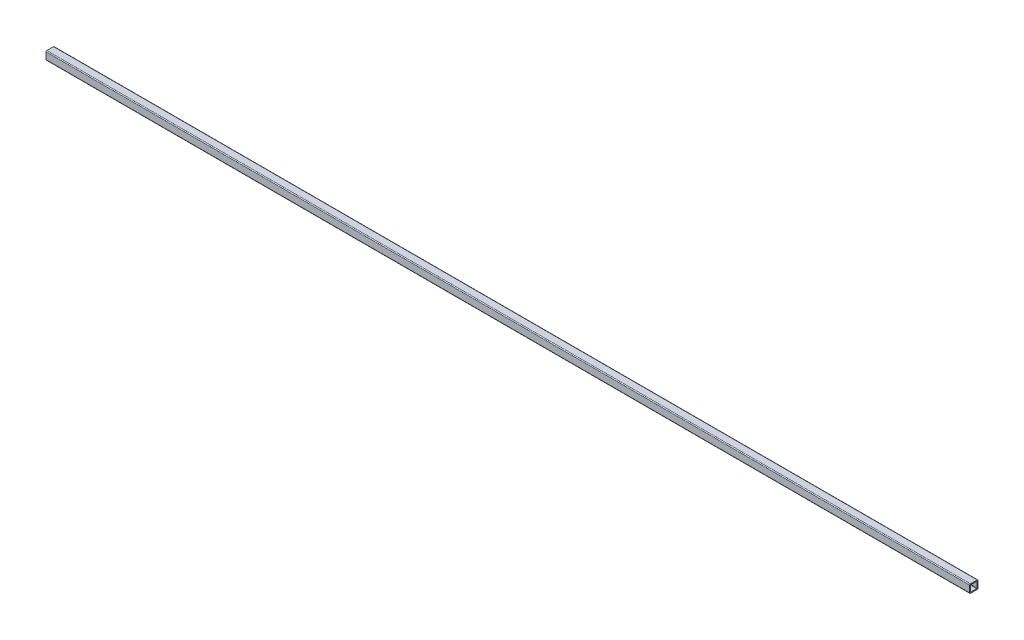
ISO-10303-21;
HEADER;
FILE_DESCRIPTION(('STEP AP214'),'2;1');
FILE_NAME('part.step','',(''),(''),'','','');
FILE_SCHEMA(('AUTOMOTIVE_DESIGN { 1 0 10303 214 1 1 1 1 }'));
ENDSEC;
DATA;
#1=APPLICATION_CONTEXT('core data for automotive mechanical design processes');
#2=APPLICATION_PROTOCOL_DEFINITION('international standard','automotive_design',2000,#1);
#3=PRODUCT_CONTEXT('',#1,'mechanical');
#4=PRODUCT('Part','Part','',(#3));
#5=PRODUCT_RELATED_PRODUCT_CATEGORY('part','',(#4));
#6=PRODUCT_DEFINITION_FORMATION('','',#4);
#7=PRODUCT_DEFINITION_CONTEXT('part definition',#1,'design');
#8=PRODUCT_DEFINITION('design','',#6,#7);
#9=PRODUCT_DEFINITION_SHAPE('','',#8);
#10=(LENGTH_UNIT() NAMED_UNIT(*) SI_UNIT(.MILLI.,.METRE.));
#11=(NAMED_UNIT(*) PLANE_ANGLE_UNIT() SI_UNIT($,.RADIAN.));
#12=(NAMED_UNIT(*) SI_UNIT($,.STERADIAN.) SOLID_ANGLE_UNIT());
#13=UNCERTAINTY_MEASURE_WITH_UNIT(LENGTH_MEASURE(1.E-05),#10,'distance_accuracy_value','');
#14=(GEOMETRIC_REPRESENTATION_CONTEXT(3) GLOBAL_UNCERTAINTY_ASSIGNED_CONTEXT((#13)) GLOBAL_UNIT_ASSIGNED_CONTEXT((#10,
#11,#12)) REPRESENTATION_CONTEXT('',''));
#15=CARTESIAN_POINT('',(0.,0.,0.));
#16=DIRECTION('',(0.,0.,1.));
#17=DIRECTION('',(1.,0.,0.));
#18=AXIS2_PLACEMENT_3D('',#15,#16,#17);
#19=CARTESIAN_POINT('',(-2830.,12.7,-12.7));
#20=DIRECTION('',(0.,0.,-1.));
#21=DIRECTION('',(0.,1.,0.));
#22=AXIS2_PLACEMENT_3D('',#19,#20,#21);
#23=PLANE('',#22);
#24=DIRECTION('',(0.,1.,0.));
#25=VECTOR('',#24,1.);
#26=CARTESIAN_POINT('',(0.,12.7,-12.7));
#27=LINE('',#26,#25);
#28=CARTESIAN_POINT('',(0.,-10.2,-12.7));
#29=VERTEX_POINT('',#28);
#30=CARTESIAN_POINT('',(0.,10.2,-12.7));
#31=VERTEX_POINT('',#30);
#32=EDGE_CURVE('E276',#29,#31,#27,.T.);
#33=ORIENTED_EDGE('',*,*,#32,.F.);
#34=DIRECTION('',(1.,0.,0.));
#35=VECTOR('',#34,1.);
#36=CARTESIAN_POINT('',(-2830.,-10.2,-12.7));
#37=LINE('',#36,#35);
#38=CARTESIAN_POINT('',(-2830.,-10.2,-12.7));
#39=VERTEX_POINT('',#38);
#40=EDGE_CURVE('E194',#29,#39,#37,.F.);
#41=ORIENTED_EDGE('',*,*,#40,.T.);
#42=DIRECTION('',(0.,1.,0.));
#43=VECTOR('',#42,1.);
#44=CARTESIAN_POINT('',(-2830.,12.7,-12.7));
#45=LINE('',#44,#43);
#46=CARTESIAN_POINT('',(-2830.,10.2,-12.7));
#47=VERTEX_POINT('',#46);
#48=EDGE_CURVE('E170',#39,#47,#45,.T.);
#49=ORIENTED_EDGE('',*,*,#48,.T.);
#50=DIRECTION('',(1.,0.,0.));
#51=VECTOR('',#50,1.);
#52=CARTESIAN_POINT('',(-2830.,10.2,-12.7));
#53=LINE('',#52,#51);
#54=EDGE_CURVE('E190',#47,#31,#53,.T.);
#55=ORIENTED_EDGE('',*,*,#54,.T.);
#56=EDGE_LOOP('',(#33,#41,#49,#55));
#57=FACE_BOUND('',#56,.T.);
#58=ADVANCED_FACE('F35',(#57),#23,.T.);
#59=CARTESIAN_POINT('',(-2830.,-12.7,12.7));
#60=DIRECTION('',(0.,-1.,0.));
#61=DIRECTION('',(0.,0.,-1.));
#62=AXIS2_PLACEMENT_3D('',#59,#60,#61);
#63=PLANE('',#62);
#64=DIRECTION('',(0.,0.,-1.));
#65=VECTOR('',#64,1.);
#66=CARTESIAN_POINT('',(-2830.,-12.7,12.7));
#67=LINE('',#66,#65);
#68=CARTESIAN_POINT('',(-2830.,-12.7,10.2));
#69=VERTEX_POINT('',#68);
#70=CARTESIAN_POINT('',(-2830.,-12.7,-10.2));
#71=VERTEX_POINT('',#70);
#72=EDGE_CURVE('E176',#69,#71,#67,.T.);
#73=ORIENTED_EDGE('',*,*,#72,.T.);
#74=DIRECTION('',(1.,0.,0.));
#75=VECTOR('',#74,1.);
#76=CARTESIAN_POINT('',(-2830.,-12.7,-10.2));
#77=LINE('',#76,#75);
#78=CARTESIAN_POINT('',(0.,-12.7,-10.2));
#79=VERTEX_POINT('',#78);
#80=EDGE_CURVE('E169',#71,#79,#77,.T.);
#81=ORIENTED_EDGE('',*,*,#80,.T.);
#82=DIRECTION('',(0.,0.,-1.));
#83=VECTOR('',#82,1.);
#84=CARTESIAN_POINT('',(0.,-12.7,12.7));
#85=LINE('',#84,#83);
#86=CARTESIAN_POINT('',(0.,-12.7,10.2));
#87=VERTEX_POINT('',#86);
#88=EDGE_CURVE('E152',#87,#79,#85,.T.);
#89=ORIENTED_EDGE('',*,*,#88,.F.);
#90=DIRECTION('',(1.,0.,0.));
#91=VECTOR('',#90,1.);
#92=CARTESIAN_POINT('',(-2830.,-12.7,10.2));
#93=LINE('',#92,#91);
#94=EDGE_CURVE('E166',#87,#69,#93,.F.);
#95=ORIENTED_EDGE('',*,*,#94,.T.);
#96=EDGE_LOOP('',(#73,#81,#89,#95));
#97=FACE_BOUND('',#96,.T.);
#98=ADVANCED_FACE('F165',(#97),#63,.T.);
#99=CARTESIAN_POINT('',(-2830.,12.7,12.7));
#100=DIRECTION('',(0.,0.,1.));
#101=DIRECTION('',(0.,-1.,0.));
#102=AXIS2_PLACEMENT_3D('',#99,#100,#101);
#103=PLANE('',#102);
#104=DIRECTION('',(0.,-1.,0.));
#105=VECTOR('',#104,1.);
#106=CARTESIAN_POINT('',(-2830.,12.7,12.7));
#107=LINE('',#106,#105);
#108=CARTESIAN_POINT('',(-2830.,10.2,12.7));
#109=VERTEX_POINT('',#108);
#110=CARTESIAN_POINT('',(-2830.,-10.2,12.7));
#111=VERTEX_POINT('',#110);
#112=EDGE_CURVE('E183',#109,#111,#107,.T.);
#113=ORIENTED_EDGE('',*,*,#112,.T.);
#114=DIRECTION('',(1.,0.,0.));
#115=VECTOR('',#114,1.);
#116=CARTESIAN_POINT('',(-2830.,-10.2,12.7));
#117=LINE('',#116,#115);
#118=CARTESIAN_POINT('',(0.,-10.2,12.7));
#119=VERTEX_POINT('',#118);
#120=EDGE_CURVE('E207',#111,#119,#117,.T.);
#121=ORIENTED_EDGE('',*,*,#120,.T.);
#122=DIRECTION('',(0.,-1.,0.));
#123=VECTOR('',#122,1.);
#124=CARTESIAN_POINT('',(0.,12.7,12.7));
#125=LINE('',#124,#123);
#126=CARTESIAN_POINT('',(0.,10.2,12.7));
#127=VERTEX_POINT('',#126);
#128=EDGE_CURVE('E154',#127,#119,#125,.T.);
#129=ORIENTED_EDGE('',*,*,#128,.F.);
#130=DIRECTION('',(1.,0.,0.));
#131=VECTOR('',#130,1.);
#132=CARTESIAN_POINT('',(-2830.,10.2,12.7));
#133=LINE('',#132,#131);
#134=EDGE_CURVE('E204',#127,#109,#133,.F.);
#135=ORIENTED_EDGE('',*,*,#134,.T.);
#136=EDGE_LOOP('',(#113,#121,#129,#135));
#137=FACE_BOUND('',#136,.T.);
#138=ADVANCED_FACE('F320',(#137),#103,.T.);
#139=CARTESIAN_POINT('',(-2830.,12.7,12.7));
#140=DIRECTION('',(0.,1.,0.));
#141=DIRECTION('',(0.,0.,1.));
#142=AXIS2_PLACEMENT_3D('',#139,#140,#141);
#143=PLANE('',#142);
#144=DIRECTION('',(0.,0.,1.));
#145=VECTOR('',#144,1.);
#146=CARTESIAN_POINT('',(0.,12.7,12.7));
#147=LINE('',#146,#145);
#148=CARTESIAN_POINT('',(0.,12.7,-10.2));
#149=VERTEX_POINT('',#148);
#150=CARTESIAN_POINT('',(0.,12.7,10.2));
#151=VERTEX_POINT('',#150);
#152=EDGE_CURVE('E279',#149,#151,#147,.T.);
#153=ORIENTED_EDGE('',*,*,#152,.F.);
#154=DIRECTION('',(1.,0.,0.));
#155=VECTOR('',#154,1.);
#156=CARTESIAN_POINT('',(-2830.,12.7,-10.2));
#157=LINE('',#156,#155);
#158=CARTESIAN_POINT('',(-2830.,12.7,-10.2));
#159=VERTEX_POINT('',#158);
#160=EDGE_CURVE('E214',#149,#159,#157,.F.);
#161=ORIENTED_EDGE('',*,*,#160,.T.);
#162=DIRECTION('',(0.,0.,1.));
#163=VECTOR('',#162,1.);
#164=CARTESIAN_POINT('',(-2830.,12.7,12.7));
#165=LINE('',#164,#163);
#166=CARTESIAN_POINT('',(-2830.,12.7,10.2));
#167=VERTEX_POINT('',#166);
#168=EDGE_CURVE('E294',#159,#167,#165,.T.);
#169=ORIENTED_EDGE('',*,*,#168,.T.);
#170=DIRECTION('',(1.,0.,0.));
#171=VECTOR('',#170,1.);
#172=CARTESIAN_POINT('',(-2830.,12.7,10.2));
#173=LINE('',#172,#171);
#174=EDGE_CURVE('E210',#167,#151,#173,.T.);
#175=ORIENTED_EDGE('',*,*,#174,.T.);
#176=EDGE_LOOP('',(#153,#161,#169,#175));
#177=FACE_BOUND('',#176,.T.);
#178=ADVANCED_FACE('F303',(#177),#143,.T.);
#179=CARTESIAN_POINT('',(-2830.,0.,0.));
#180=DIRECTION('',(1.,0.,0.));
#181=DIRECTION('',(0.,0.,-1.));
#182=AXIS2_PLACEMENT_3D('',#179,#180,#181);
#183=PLANE('',#182);
#184=DIRECTION('',(0.,-1.,0.));
#185=VECTOR('',#184,1.);
#186=CARTESIAN_POINT('',(-2830.,-9.652,9.652));
#187=LINE('',#186,#185);
#188=CARTESIAN_POINT('',(-2830.,8.652,9.652));
#189=VERTEX_POINT('',#188);
#190=CARTESIAN_POINT('',(-2830.,-8.652,9.652));
#191=VERTEX_POINT('',#190);
#192=EDGE_CURVE('E272',#189,#191,#187,.T.);
#193=ORIENTED_EDGE('',*,*,#192,.T.);
#194=CARTESIAN_POINT('',(-2830.,-8.652,8.652));
#195=DIRECTION('',(1.,0.,0.));
#196=DIRECTION('',(0.,0.,-1.));
#197=AXIS2_PLACEMENT_3D('',#194,#195,#196);
#198=CIRCLE('',#197,1.);
#199=CARTESIAN_POINT('',(-2830.,-9.652,8.652));
#200=VERTEX_POINT('',#199);
#201=EDGE_CURVE('E11',#191,#200,#198,.T.);
#202=ORIENTED_EDGE('',*,*,#201,.T.);
#203=DIRECTION('',(0.,0.,-1.));
#204=VECTOR('',#203,1.);
#205=CARTESIAN_POINT('',(-2830.,-9.652,9.652));
#206=LINE('',#205,#204);
#207=CARTESIAN_POINT('',(-2830.,-9.652,-8.652));
#208=VERTEX_POINT('',#207);
#209=EDGE_CURVE('E270',#200,#208,#206,.T.);
#210=ORIENTED_EDGE('',*,*,#209,.T.);
#211=CARTESIAN_POINT('',(-2830.,-8.652,-8.652));
#212=DIRECTION('',(1.,0.,0.));
#213=DIRECTION('',(0.,0.,-1.));
#214=AXIS2_PLACEMENT_3D('',#211,#212,#213);
#215=CIRCLE('',#214,1.);
#216=CARTESIAN_POINT('',(-2830.,-8.652,-9.652));
#217=VERTEX_POINT('',#216);
#218=EDGE_CURVE('E244',#208,#217,#215,.T.);
#219=ORIENTED_EDGE('',*,*,#218,.T.);
#220=DIRECTION('',(0.,1.,0.));
#221=VECTOR('',#220,1.);
#222=CARTESIAN_POINT('',(-2830.,-9.652,-9.652));
#223=LINE('',#222,#221);
#224=CARTESIAN_POINT('',(-2830.,8.652,-9.652));
#225=VERTEX_POINT('',#224);
#226=EDGE_CURVE('E291',#217,#225,#223,.T.);
#227=ORIENTED_EDGE('',*,*,#226,.T.);
#228=CARTESIAN_POINT('',(-2830.,8.652,-8.652));
#229=DIRECTION('',(1.,0.,0.));
#230=DIRECTION('',(0.,0.,-1.));
#231=AXIS2_PLACEMENT_3D('',#228,#229,#230);
#232=CIRCLE('',#231,1.);
#233=CARTESIAN_POINT('',(-2830.,9.652,-8.652));
#234=VERTEX_POINT('',#233);
#235=EDGE_CURVE('E248',#225,#234,#232,.T.);
#236=ORIENTED_EDGE('',*,*,#235,.T.);
#237=DIRECTION('',(0.,0.,1.));
#238=VECTOR('',#237,1.);
#239=CARTESIAN_POINT('',(-2830.,9.652,9.652));
#240=LINE('',#239,#238);
#241=CARTESIAN_POINT('',(-2830.,9.652,8.652));
#242=VERTEX_POINT('',#241);
#243=EDGE_CURVE('E281',#234,#242,#240,.T.);
#244=ORIENTED_EDGE('',*,*,#243,.T.);
#245=CARTESIAN_POINT('',(-2830.,8.652,8.652));
#246=DIRECTION('',(1.,0.,0.));
#247=DIRECTION('',(0.,0.,-1.));
#248=AXIS2_PLACEMENT_3D('',#245,#246,#247);
#249=CIRCLE('',#248,1.);
#250=EDGE_CURVE('E57',#242,#189,#249,.T.);
#251=ORIENTED_EDGE('',*,*,#250,.T.);
#252=EDGE_LOOP('',(#193,#202,#210,#219,#227,#236,#244,#251));
#253=FACE_BOUND('',#252,.T.);
#254=ORIENTED_EDGE('',*,*,#48,.F.);
#255=CARTESIAN_POINT('',(-2830.,-10.2,-10.2));
#256=DIRECTION('',(1.,0.,0.));
#257=DIRECTION('',(0.,0.,-1.));
#258=AXIS2_PLACEMENT_3D('',#255,#256,#257);
#259=CIRCLE('',#258,2.5);
#260=EDGE_CURVE('E202',#39,#71,#259,.F.);
#261=ORIENTED_EDGE('',*,*,#260,.T.);
#262=ORIENTED_EDGE('',*,*,#72,.F.);
#263=CARTESIAN_POINT('',(-2830.,-10.2,10.2));
#264=DIRECTION('',(1.,0.,0.));
#265=DIRECTION('',(0.,0.,-1.));
#266=AXIS2_PLACEMENT_3D('',#263,#264,#265);
#267=CIRCLE('',#266,2.5);
#268=EDGE_CURVE('E174',#69,#111,#267,.F.);
#269=ORIENTED_EDGE('',*,*,#268,.T.);
#270=ORIENTED_EDGE('',*,*,#112,.F.);
#271=CARTESIAN_POINT('',(-2830.,10.2,10.2));
#272=DIRECTION('',(1.,0.,0.));
#273=DIRECTION('',(0.,0.,-1.));
#274=AXIS2_PLACEMENT_3D('',#271,#272,#273);
#275=CIRCLE('',#274,2.5);
#276=EDGE_CURVE('E197',#109,#167,#275,.F.);
#277=ORIENTED_EDGE('',*,*,#276,.T.);
#278=ORIENTED_EDGE('',*,*,#168,.F.);
#279=CARTESIAN_POINT('',(-2830.,10.2,-10.2));
#280=DIRECTION('',(1.,0.,0.));
#281=DIRECTION('',(0.,0.,-1.));
#282=AXIS2_PLACEMENT_3D('',#279,#280,#281);
#283=CIRCLE('',#282,2.5);
#284=EDGE_CURVE('E199',#159,#47,#283,.F.);
#285=ORIENTED_EDGE('',*,*,#284,.T.);
#286=EDGE_LOOP('',(#254,#261,#262,#269,#270,#277,#278,#285));
#287=FACE_BOUND('',#286,.T.);
#288=ADVANCED_FACE('F268',(#253,#287),#183,.F.);
#289=CARTESIAN_POINT('',(0.,0.,0.));
#290=DIRECTION('',(1.,0.,0.));
#291=DIRECTION('',(0.,0.,-1.));
#292=AXIS2_PLACEMENT_3D('',#289,#290,#291);
#293=PLANE('',#292);
#294=DIRECTION('',(0.,1.,0.));
#295=VECTOR('',#294,1.);
#296=CARTESIAN_POINT('',(0.,-9.652,-9.652));
#297=LINE('',#296,#295);
#298=CARTESIAN_POINT('',(0.,-8.652,-9.652));
#299=VERTEX_POINT('',#298);
#300=CARTESIAN_POINT('',(0.,8.652,-9.652));
#301=VERTEX_POINT('',#300);
#302=EDGE_CURVE('E285',#299,#301,#297,.T.);
#303=ORIENTED_EDGE('',*,*,#302,.F.);
#304=CARTESIAN_POINT('',(0.,-8.652,-8.652));
#305=DIRECTION('',(1.,0.,0.));
#306=DIRECTION('',(0.,0.,-1.));
#307=AXIS2_PLACEMENT_3D('',#304,#305,#306);
#308=CIRCLE('',#307,1.);
#309=CARTESIAN_POINT('',(0.,-9.652,-8.652));
#310=VERTEX_POINT('',#309);
#311=EDGE_CURVE('E242',#299,#310,#308,.F.);
#312=ORIENTED_EDGE('',*,*,#311,.T.);
#313=DIRECTION('',(0.,0.,-1.));
#314=VECTOR('',#313,1.);
#315=CARTESIAN_POINT('',(0.,-9.652,9.652));
#316=LINE('',#315,#314);
#317=CARTESIAN_POINT('',(0.,-9.652,8.652));
#318=VERTEX_POINT('',#317);
#319=EDGE_CURVE('E258',#318,#310,#316,.T.);
#320=ORIENTED_EDGE('',*,*,#319,.F.);
#321=CARTESIAN_POINT('',(0.,-8.652,8.652));
#322=DIRECTION('',(1.,0.,0.));
#323=DIRECTION('',(0.,0.,-1.));
#324=AXIS2_PLACEMENT_3D('',#321,#322,#323);
#325=CIRCLE('',#324,1.);
#326=CARTESIAN_POINT('',(0.,-8.652,9.652));
#327=VERTEX_POINT('',#326);
#328=EDGE_CURVE('E43',#318,#327,#325,.F.);
#329=ORIENTED_EDGE('',*,*,#328,.T.);
#330=DIRECTION('',(0.,-1.,0.));
#331=VECTOR('',#330,1.);
#332=CARTESIAN_POINT('',(0.,-9.652,9.652));
#333=LINE('',#332,#331);
#334=CARTESIAN_POINT('',(0.,8.652,9.652));
#335=VERTEX_POINT('',#334);
#336=EDGE_CURVE('E256',#335,#327,#333,.T.);
#337=ORIENTED_EDGE('',*,*,#336,.F.);
#338=CARTESIAN_POINT('',(0.,8.652,8.652));
#339=DIRECTION('',(1.,0.,0.));
#340=DIRECTION('',(0.,0.,-1.));
#341=AXIS2_PLACEMENT_3D('',#338,#339,#340);
#342=CIRCLE('',#341,1.);
#343=CARTESIAN_POINT('',(0.,9.652,8.652));
#344=VERTEX_POINT('',#343);
#345=EDGE_CURVE('E250',#335,#344,#342,.F.);
#346=ORIENTED_EDGE('',*,*,#345,.T.);
#347=DIRECTION('',(0.,0.,1.));
#348=VECTOR('',#347,1.);
#349=CARTESIAN_POINT('',(0.,9.652,9.652));
#350=LINE('',#349,#348);
#351=CARTESIAN_POINT('',(0.,9.652,-8.652));
#352=VERTEX_POINT('',#351);
#353=EDGE_CURVE('E263',#352,#344,#350,.T.);
#354=ORIENTED_EDGE('',*,*,#353,.F.);
#355=CARTESIAN_POINT('',(0.,8.652,-8.652));
#356=DIRECTION('',(1.,0.,0.));
#357=DIRECTION('',(0.,0.,-1.));
#358=AXIS2_PLACEMENT_3D('',#355,#356,#357);
#359=CIRCLE('',#358,1.);
#360=EDGE_CURVE('E246',#352,#301,#359,.F.);
#361=ORIENTED_EDGE('',*,*,#360,.T.);
#362=EDGE_LOOP('',(#303,#312,#320,#329,#337,#346,#354,#361));
#363=FACE_BOUND('',#362,.T.);
#364=ORIENTED_EDGE('',*,*,#88,.T.);
#365=CARTESIAN_POINT('',(0.,-10.2,-10.2));
#366=DIRECTION('',(1.,0.,0.));
#367=DIRECTION('',(0.,0.,-1.));
#368=AXIS2_PLACEMENT_3D('',#365,#366,#367);
#369=CIRCLE('',#368,2.5);
#370=EDGE_CURVE('E159',#79,#29,#369,.T.);
#371=ORIENTED_EDGE('',*,*,#370,.T.);
#372=ORIENTED_EDGE('',*,*,#32,.T.);
#373=CARTESIAN_POINT('',(0.,10.2,-10.2));
#374=DIRECTION('',(1.,0.,0.));
#375=DIRECTION('',(0.,0.,-1.));
#376=AXIS2_PLACEMENT_3D('',#373,#374,#375);
#377=CIRCLE('',#376,2.5);
#378=EDGE_CURVE('E160',#31,#149,#377,.T.);
#379=ORIENTED_EDGE('',*,*,#378,.T.);
#380=ORIENTED_EDGE('',*,*,#152,.T.);
#381=CARTESIAN_POINT('',(0.,10.2,10.2));
#382=DIRECTION('',(1.,0.,0.));
#383=DIRECTION('',(0.,0.,-1.));
#384=AXIS2_PLACEMENT_3D('',#381,#382,#383);
#385=CIRCLE('',#384,2.5);
#386=EDGE_CURVE('E181',#151,#127,#385,.T.);
#387=ORIENTED_EDGE('',*,*,#386,.T.);
#388=ORIENTED_EDGE('',*,*,#128,.T.);
#389=CARTESIAN_POINT('',(0.,-10.2,10.2));
#390=DIRECTION('',(1.,0.,0.));
#391=DIRECTION('',(0.,0.,-1.));
#392=AXIS2_PLACEMENT_3D('',#389,#390,#391);
#393=CIRCLE('',#392,2.5);
#394=EDGE_CURVE('E149',#119,#87,#393,.T.);
#395=ORIENTED_EDGE('',*,*,#394,.T.);
#396=EDGE_LOOP('',(#364,#371,#372,#379,#380,#387,#388,#395));
#397=FACE_BOUND('',#396,.T.);
#398=ADVANCED_FACE('F151',(#363,#397),#293,.T.);
#399=CARTESIAN_POINT('',(-2830.,-9.652,-9.652));
#400=DIRECTION('',(0.,0.,-1.));
#401=DIRECTION('',(-1.,0.,0.));
#402=AXIS2_PLACEMENT_3D('',#399,#400,#401);
#403=PLANE('',#402);
#404=ORIENTED_EDGE('',*,*,#226,.F.);
#405=DIRECTION('',(1.,0.,0.));
#406=VECTOR('',#405,1.);
#407=CARTESIAN_POINT('',(0.,-8.652,-9.652));
#408=LINE('',#407,#406);
#409=EDGE_CURVE('E220',#217,#299,#408,.T.);
#410=ORIENTED_EDGE('',*,*,#409,.T.);
#411=ORIENTED_EDGE('',*,*,#302,.T.);
#412=DIRECTION('',(1.,0.,0.));
#413=VECTOR('',#412,1.);
#414=CARTESIAN_POINT('',(-2830.,8.652,-9.652));
#415=LINE('',#414,#413);
#416=EDGE_CURVE('E217',#301,#225,#415,.F.);
#417=ORIENTED_EDGE('',*,*,#416,.T.);
#418=EDGE_LOOP('',(#404,#410,#411,#417));
#419=FACE_BOUND('',#418,.T.);
#420=ADVANCED_FACE('F381',(#419),#403,.F.);
#421=CARTESIAN_POINT('',(-2830.,-9.652,9.652));
#422=DIRECTION('',(0.,-1.,0.));
#423=DIRECTION('',(0.,0.,-1.));
#424=AXIS2_PLACEMENT_3D('',#421,#422,#423);
#425=PLANE('',#424);
#426=ORIENTED_EDGE('',*,*,#319,.T.);
#427=DIRECTION('',(1.,0.,0.));
#428=VECTOR('',#427,1.);
#429=CARTESIAN_POINT('',(-2830.,-9.652,-8.652));
#430=LINE('',#429,#428);
#431=EDGE_CURVE('E228',#310,#208,#430,.F.);
#432=ORIENTED_EDGE('',*,*,#431,.T.);
#433=ORIENTED_EDGE('',*,*,#209,.F.);
#434=DIRECTION('',(1.,0.,0.));
#435=VECTOR('',#434,1.);
#436=CARTESIAN_POINT('',(0.,-9.652,8.652));
#437=LINE('',#436,#435);
#438=EDGE_CURVE('E224',#200,#318,#437,.T.);
#439=ORIENTED_EDGE('',*,*,#438,.T.);
#440=EDGE_LOOP('',(#426,#432,#433,#439));
#441=FACE_BOUND('',#440,.T.);
#442=ADVANCED_FACE('F274',(#441),#425,.F.);
#443=CARTESIAN_POINT('',(-2830.,-9.652,9.652));
#444=DIRECTION('',(0.,0.,1.));
#445=DIRECTION('',(1.,0.,0.));
#446=AXIS2_PLACEMENT_3D('',#443,#444,#445);
#447=PLANE('',#446);
#448=ORIENTED_EDGE('',*,*,#192,.F.);
#449=DIRECTION('',(1.,0.,0.));
#450=VECTOR('',#449,1.);
#451=CARTESIAN_POINT('',(0.,8.652,9.652));
#452=LINE('',#451,#450);
#453=EDGE_CURVE('E239',#189,#335,#452,.T.);
#454=ORIENTED_EDGE('',*,*,#453,.T.);
#455=ORIENTED_EDGE('',*,*,#336,.T.);
#456=DIRECTION('',(1.,0.,0.));
#457=VECTOR('',#456,1.);
#458=CARTESIAN_POINT('',(-2830.,-8.652,9.652));
#459=LINE('',#458,#457);
#460=EDGE_CURVE('E50',#327,#191,#459,.F.);
#461=ORIENTED_EDGE('',*,*,#460,.T.);
#462=EDGE_LOOP('',(#448,#454,#455,#461));
#463=FACE_BOUND('',#462,.T.);
#464=ADVANCED_FACE('F261',(#463),#447,.F.);
#465=CARTESIAN_POINT('',(-2830.,9.652,9.652));
#466=DIRECTION('',(0.,1.,0.));
#467=DIRECTION('',(0.,0.,1.));
#468=AXIS2_PLACEMENT_3D('',#465,#466,#467);
#469=PLANE('',#468);
#470=ORIENTED_EDGE('',*,*,#243,.F.);
#471=DIRECTION('',(1.,0.,0.));
#472=VECTOR('',#471,1.);
#473=CARTESIAN_POINT('',(0.,9.652,-8.652));
#474=LINE('',#473,#472);
#475=EDGE_CURVE('E234',#234,#352,#474,.T.);
#476=ORIENTED_EDGE('',*,*,#475,.T.);
#477=ORIENTED_EDGE('',*,*,#353,.T.);
#478=DIRECTION('',(1.,0.,0.));
#479=VECTOR('',#478,1.);
#480=CARTESIAN_POINT('',(-2830.,9.652,8.652));
#481=LINE('',#480,#479);
#482=EDGE_CURVE('E231',#344,#242,#481,.F.);
#483=ORIENTED_EDGE('',*,*,#482,.T.);
#484=EDGE_LOOP('',(#470,#476,#477,#483));
#485=FACE_BOUND('',#484,.T.);
#486=ADVANCED_FACE('F346',(#485),#469,.F.);
#487=CARTESIAN_POINT('',(-2830.,-10.2,-10.2));
#488=DIRECTION('',(1.,0.,0.));
#489=DIRECTION('',(0.,0.,-1.));
#490=AXIS2_PLACEMENT_3D('',#487,#488,#489);
#491=CYLINDRICAL_SURFACE('',#490,2.5);
#492=ORIENTED_EDGE('',*,*,#260,.F.);
#493=ORIENTED_EDGE('',*,*,#40,.F.);
#494=ORIENTED_EDGE('',*,*,#370,.F.);
#495=ORIENTED_EDGE('',*,*,#80,.F.);
#496=EDGE_LOOP('',(#492,#493,#494,#495));
#497=FACE_BOUND('',#496,.T.);
#498=ADVANCED_FACE('F316',(#497),#491,.T.);
#499=CARTESIAN_POINT('',(-2830.,-10.2,10.2));
#500=DIRECTION('',(1.,0.,0.));
#501=DIRECTION('',(0.,0.,-1.));
#502=AXIS2_PLACEMENT_3D('',#499,#500,#501);
#503=CYLINDRICAL_SURFACE('',#502,2.5);
#504=ORIENTED_EDGE('',*,*,#268,.F.);
#505=ORIENTED_EDGE('',*,*,#94,.F.);
#506=ORIENTED_EDGE('',*,*,#394,.F.);
#507=ORIENTED_EDGE('',*,*,#120,.F.);
#508=EDGE_LOOP('',(#504,#505,#506,#507));
#509=FACE_BOUND('',#508,.T.);
#510=ADVANCED_FACE('F173',(#509),#503,.T.);
#511=CARTESIAN_POINT('',(-2830.,10.2,-10.2));
#512=DIRECTION('',(1.,0.,0.));
#513=DIRECTION('',(0.,0.,-1.));
#514=AXIS2_PLACEMENT_3D('',#511,#512,#513);
#515=CYLINDRICAL_SURFACE('',#514,2.5);
#516=ORIENTED_EDGE('',*,*,#284,.F.);
#517=ORIENTED_EDGE('',*,*,#160,.F.);
#518=ORIENTED_EDGE('',*,*,#378,.F.);
#519=ORIENTED_EDGE('',*,*,#54,.F.);
#520=EDGE_LOOP('',(#516,#517,#518,#519));
#521=FACE_BOUND('',#520,.T.);
#522=ADVANCED_FACE('F308',(#521),#515,.T.);
#523=CARTESIAN_POINT('',(-2830.,10.2,10.2));
#524=DIRECTION('',(1.,0.,0.));
#525=DIRECTION('',(0.,0.,-1.));
#526=AXIS2_PLACEMENT_3D('',#523,#524,#525);
#527=CYLINDRICAL_SURFACE('',#526,2.5);
#528=ORIENTED_EDGE('',*,*,#276,.F.);
#529=ORIENTED_EDGE('',*,*,#134,.F.);
#530=ORIENTED_EDGE('',*,*,#386,.F.);
#531=ORIENTED_EDGE('',*,*,#174,.F.);
#532=EDGE_LOOP('',(#528,#529,#530,#531));
#533=FACE_BOUND('',#532,.T.);
#534=ADVANCED_FACE('F323',(#533),#527,.T.);
#535=CARTESIAN_POINT('',(-2830.,-8.652,-8.652));
#536=DIRECTION('',(-1.,0.,0.));
#537=DIRECTION('',(0.,0.,1.));
#538=AXIS2_PLACEMENT_3D('',#535,#536,#537);
#539=CYLINDRICAL_SURFACE('',#538,1.);
#540=ORIENTED_EDGE('',*,*,#218,.F.);
#541=ORIENTED_EDGE('',*,*,#431,.F.);
#542=ORIENTED_EDGE('',*,*,#311,.F.);
#543=ORIENTED_EDGE('',*,*,#409,.F.);
#544=EDGE_LOOP('',(#540,#541,#542,#543));
#545=FACE_BOUND('',#544,.T.);
#546=ADVANCED_FACE('F325',(#545),#539,.F.);
#547=CARTESIAN_POINT('',(-2830.,8.652,-8.652));
#548=DIRECTION('',(-1.,0.,0.));
#549=DIRECTION('',(0.,0.,1.));
#550=AXIS2_PLACEMENT_3D('',#547,#548,#549);
#551=CYLINDRICAL_SURFACE('',#550,1.);
#552=ORIENTED_EDGE('',*,*,#235,.F.);
#553=ORIENTED_EDGE('',*,*,#416,.F.);
#554=ORIENTED_EDGE('',*,*,#360,.F.);
#555=ORIENTED_EDGE('',*,*,#475,.F.);
#556=EDGE_LOOP('',(#552,#553,#554,#555));
#557=FACE_BOUND('',#556,.T.);
#558=ADVANCED_FACE('F331',(#557),#551,.F.);
#559=CARTESIAN_POINT('',(-2830.,8.652,8.652));
#560=DIRECTION('',(-1.,0.,0.));
#561=DIRECTION('',(0.,0.,1.));
#562=AXIS2_PLACEMENT_3D('',#559,#560,#561);
#563=CYLINDRICAL_SURFACE('',#562,1.);
#564=ORIENTED_EDGE('',*,*,#250,.F.);
#565=ORIENTED_EDGE('',*,*,#482,.F.);
#566=ORIENTED_EDGE('',*,*,#345,.F.);
#567=ORIENTED_EDGE('',*,*,#453,.F.);
#568=EDGE_LOOP('',(#564,#565,#566,#567));
#569=FACE_BOUND('',#568,.T.);
#570=ADVANCED_FACE('F429',(#569),#563,.F.);
#571=CARTESIAN_POINT('',(-2830.,-8.652,8.652));
#572=DIRECTION('',(-1.,0.,0.));
#573=DIRECTION('',(0.,0.,1.));
#574=AXIS2_PLACEMENT_3D('',#571,#572,#573);
#575=CYLINDRICAL_SURFACE('',#574,1.);
#576=ORIENTED_EDGE('',*,*,#201,.F.);
#577=ORIENTED_EDGE('',*,*,#460,.F.);
#578=ORIENTED_EDGE('',*,*,#328,.F.);
#579=ORIENTED_EDGE('',*,*,#438,.F.);
#580=EDGE_LOOP('',(#576,#577,#578,#579));
#581=FACE_BOUND('',#580,.T.);
#582=ADVANCED_FACE('F37',(#581),#575,.F.);
#583=CLOSED_SHELL('',(#58,#98,#138,#178,#288,#398,#420,#442,#464,#486,#498,#510,#522,#534,#546,
#558,#570,#582));
#584=MANIFOLD_SOLID_BREP('B2',#583);
#585=ADVANCED_BREP_SHAPE_REPRESENTATION('',(#18,#584),#14);
#586=SHAPE_DEFINITION_REPRESENTATION(#9,#585);
ENDSEC;
END-ISO-10303-21;
